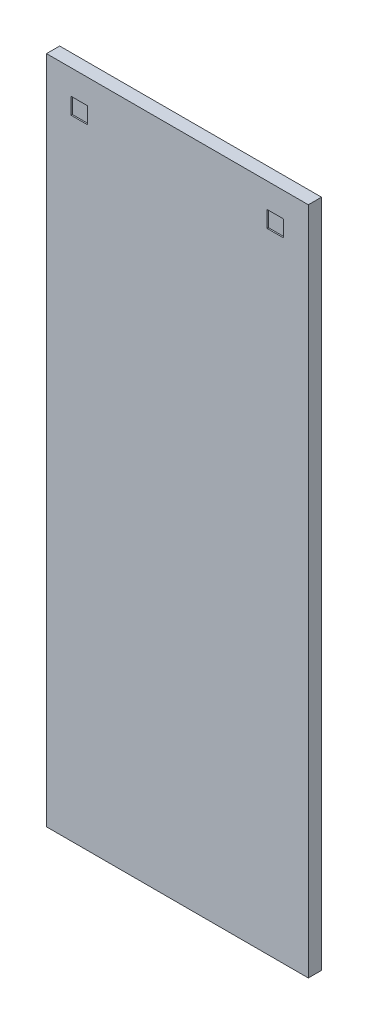
ISO-10303-21;
HEADER;
FILE_DESCRIPTION(('STEP AP214'),'2;1');
FILE_NAME('part.step','',(''),(''),'','','');
FILE_SCHEMA(('AUTOMOTIVE_DESIGN { 1 0 10303 214 1 1 1 1 }'));
ENDSEC;
DATA;
#1=APPLICATION_CONTEXT('core data for automotive mechanical design processes');
#2=APPLICATION_PROTOCOL_DEFINITION('international standard','automotive_design',2000,#1);
#3=PRODUCT_CONTEXT('',#1,'mechanical');
#4=PRODUCT('Part','Part','',(#3));
#5=PRODUCT_RELATED_PRODUCT_CATEGORY('part','',(#4));
#6=PRODUCT_DEFINITION_FORMATION('','',#4);
#7=PRODUCT_DEFINITION_CONTEXT('part definition',#1,'design');
#8=PRODUCT_DEFINITION('design','',#6,#7);
#9=PRODUCT_DEFINITION_SHAPE('','',#8);
#10=(LENGTH_UNIT() NAMED_UNIT(*) SI_UNIT(.MILLI.,.METRE.));
#11=(NAMED_UNIT(*) PLANE_ANGLE_UNIT() SI_UNIT($,.RADIAN.));
#12=(NAMED_UNIT(*) SI_UNIT($,.STERADIAN.) SOLID_ANGLE_UNIT());
#13=UNCERTAINTY_MEASURE_WITH_UNIT(LENGTH_MEASURE(1.E-05),#10,'distance_accuracy_value','');
#14=(GEOMETRIC_REPRESENTATION_CONTEXT(3) GLOBAL_UNCERTAINTY_ASSIGNED_CONTEXT((#13)) GLOBAL_UNIT_ASSIGNED_CONTEXT((#10,
#11,#12)) REPRESENTATION_CONTEXT('',''));
#15=CARTESIAN_POINT('',(0.,0.,0.));
#16=DIRECTION('',(0.,0.,1.));
#17=DIRECTION('',(1.,0.,0.));
#18=AXIS2_PLACEMENT_3D('',#15,#16,#17);
#19=CARTESIAN_POINT('',(-199.,-509.,20.));
#20=DIRECTION('',(1.,0.,0.));
#21=DIRECTION('',(0.,0.,-1.));
#22=AXIS2_PLACEMENT_3D('',#19,#20,#21);
#23=PLANE('',#22);
#24=DIRECTION('',(0.,-1.,0.));
#25=VECTOR('',#24,1.);
#26=CARTESIAN_POINT('',(-199.,-509.,0.));
#27=LINE('',#26,#25);
#28=CARTESIAN_POINT('',(-199.,509.,0.));
#29=VERTEX_POINT('',#28);
#30=CARTESIAN_POINT('',(-199.,-509.,0.));
#31=VERTEX_POINT('',#30);
#32=EDGE_CURVE('E156',#29,#31,#27,.T.);
#33=ORIENTED_EDGE('',*,*,#32,.T.);
#34=DIRECTION('',(0.,0.,-1.));
#35=VECTOR('',#34,1.);
#36=CARTESIAN_POINT('',(-199.,-509.,20.));
#37=LINE('',#36,#35);
#38=CARTESIAN_POINT('',(-199.,-509.,20.));
#39=VERTEX_POINT('',#38);
#40=EDGE_CURVE('E11',#39,#31,#37,.T.);
#41=ORIENTED_EDGE('',*,*,#40,.F.);
#42=DIRECTION('',(0.,-1.,0.));
#43=VECTOR('',#42,1.);
#44=CARTESIAN_POINT('',(-199.,-509.,20.));
#45=LINE('',#44,#43);
#46=CARTESIAN_POINT('',(-199.,509.,20.));
#47=VERTEX_POINT('',#46);
#48=EDGE_CURVE('E189',#47,#39,#45,.T.);
#49=ORIENTED_EDGE('',*,*,#48,.F.);
#50=DIRECTION('',(0.,0.,-1.));
#51=VECTOR('',#50,1.);
#52=CARTESIAN_POINT('',(-199.,509.,20.));
#53=LINE('',#52,#51);
#54=EDGE_CURVE('E199',#47,#29,#53,.T.);
#55=ORIENTED_EDGE('',*,*,#54,.T.);
#56=EDGE_LOOP('',(#33,#41,#49,#55));
#57=FACE_BOUND('',#56,.T.);
#58=ADVANCED_FACE('F32',(#57),#23,.F.);
#59=CARTESIAN_POINT('',(199.,-509.,20.));
#60=DIRECTION('',(0.,1.,0.));
#61=DIRECTION('',(0.,0.,1.));
#62=AXIS2_PLACEMENT_3D('',#59,#60,#61);
#63=PLANE('',#62);
#64=DIRECTION('',(1.,0.,0.));
#65=VECTOR('',#64,1.);
#66=CARTESIAN_POINT('',(199.,-509.,0.));
#67=LINE('',#66,#65);
#68=CARTESIAN_POINT('',(199.,-509.,0.));
#69=VERTEX_POINT('',#68);
#70=EDGE_CURVE('E202',#31,#69,#67,.T.);
#71=ORIENTED_EDGE('',*,*,#70,.T.);
#72=DIRECTION('',(0.,0.,-1.));
#73=VECTOR('',#72,1.);
#74=CARTESIAN_POINT('',(199.,-509.,20.));
#75=LINE('',#74,#73);
#76=CARTESIAN_POINT('',(199.,-509.,20.));
#77=VERTEX_POINT('',#76);
#78=EDGE_CURVE('E39',#77,#69,#75,.T.);
#79=ORIENTED_EDGE('',*,*,#78,.F.);
#80=DIRECTION('',(1.,0.,0.));
#81=VECTOR('',#80,1.);
#82=CARTESIAN_POINT('',(199.,-509.,20.));
#83=LINE('',#82,#81);
#84=EDGE_CURVE('E192',#39,#77,#83,.T.);
#85=ORIENTED_EDGE('',*,*,#84,.F.);
#86=ORIENTED_EDGE('',*,*,#40,.T.);
#87=EDGE_LOOP('',(#71,#79,#85,#86));
#88=FACE_BOUND('',#87,.T.);
#89=ADVANCED_FACE('F232',(#88),#63,.F.);
#90=CARTESIAN_POINT('',(199.,-509.,20.));
#91=DIRECTION('',(-1.,0.,0.));
#92=DIRECTION('',(0.,0.,1.));
#93=AXIS2_PLACEMENT_3D('',#90,#91,#92);
#94=PLANE('',#93);
#95=DIRECTION('',(0.,1.,0.));
#96=VECTOR('',#95,1.);
#97=CARTESIAN_POINT('',(199.,-509.,0.));
#98=LINE('',#97,#96);
#99=CARTESIAN_POINT('',(199.,509.,0.));
#100=VERTEX_POINT('',#99);
#101=EDGE_CURVE('E204',#69,#100,#98,.T.);
#102=ORIENTED_EDGE('',*,*,#101,.T.);
#103=DIRECTION('',(0.,0.,-1.));
#104=VECTOR('',#103,1.);
#105=CARTESIAN_POINT('',(199.,509.,20.));
#106=LINE('',#105,#104);
#107=CARTESIAN_POINT('',(199.,509.,20.));
#108=VERTEX_POINT('',#107);
#109=EDGE_CURVE('E209',#108,#100,#106,.T.);
#110=ORIENTED_EDGE('',*,*,#109,.F.);
#111=DIRECTION('',(0.,1.,0.));
#112=VECTOR('',#111,1.);
#113=CARTESIAN_POINT('',(199.,-509.,20.));
#114=LINE('',#113,#112);
#115=EDGE_CURVE('E195',#77,#108,#114,.T.);
#116=ORIENTED_EDGE('',*,*,#115,.F.);
#117=ORIENTED_EDGE('',*,*,#78,.T.);
#118=EDGE_LOOP('',(#102,#110,#116,#117));
#119=FACE_BOUND('',#118,.T.);
#120=ADVANCED_FACE('F216',(#119),#94,.F.);
#121=CARTESIAN_POINT('',(199.,509.,20.));
#122=DIRECTION('',(0.,-1.,0.));
#123=DIRECTION('',(0.,0.,-1.));
#124=AXIS2_PLACEMENT_3D('',#121,#122,#123);
#125=PLANE('',#124);
#126=DIRECTION('',(-1.,0.,0.));
#127=VECTOR('',#126,1.);
#128=CARTESIAN_POINT('',(199.,509.,0.));
#129=LINE('',#128,#127);
#130=EDGE_CURVE('E193',#100,#29,#129,.T.);
#131=ORIENTED_EDGE('',*,*,#130,.T.);
#132=ORIENTED_EDGE('',*,*,#54,.F.);
#133=DIRECTION('',(-1.,0.,0.));
#134=VECTOR('',#133,1.);
#135=CARTESIAN_POINT('',(199.,509.,20.));
#136=LINE('',#135,#134);
#137=EDGE_CURVE('E197',#108,#47,#136,.T.);
#138=ORIENTED_EDGE('',*,*,#137,.F.);
#139=ORIENTED_EDGE('',*,*,#109,.T.);
#140=EDGE_LOOP('',(#131,#132,#138,#139));
#141=FACE_BOUND('',#140,.T.);
#142=ADVANCED_FACE('F225',(#141),#125,.F.);
#143=CARTESIAN_POINT('',(0.,0.,20.));
#144=DIRECTION('',(0.,0.,1.));
#145=DIRECTION('',(1.,0.,0.));
#146=AXIS2_PLACEMENT_3D('',#143,#144,#145);
#147=PLANE('',#146);
#148=DIRECTION('',(0.,-1.,0.));
#149=VECTOR('',#148,1.);
#150=CARTESIAN_POINT('',(136.5,446.5,20.));
#151=LINE('',#150,#149);
#152=CARTESIAN_POINT('',(136.5,471.5,20.));
#153=VERTEX_POINT('',#152);
#154=CARTESIAN_POINT('',(136.5,446.5,20.));
#155=VERTEX_POINT('',#154);
#156=EDGE_CURVE('E46',#153,#155,#151,.T.);
#157=ORIENTED_EDGE('',*,*,#156,.F.);
#158=DIRECTION('',(-1.,0.,0.));
#159=VECTOR('',#158,1.);
#160=CARTESIAN_POINT('',(161.5,471.5,20.));
#161=LINE('',#160,#159);
#162=CARTESIAN_POINT('',(161.5,471.5,20.));
#163=VERTEX_POINT('',#162);
#164=EDGE_CURVE('E140',#163,#153,#161,.T.);
#165=ORIENTED_EDGE('',*,*,#164,.F.);
#166=DIRECTION('',(0.,1.,0.));
#167=VECTOR('',#166,1.);
#168=CARTESIAN_POINT('',(161.5,446.5,20.));
#169=LINE('',#168,#167);
#170=CARTESIAN_POINT('',(161.5,446.5,20.));
#171=VERTEX_POINT('',#170);
#172=EDGE_CURVE('E143',#171,#163,#169,.T.);
#173=ORIENTED_EDGE('',*,*,#172,.F.);
#174=DIRECTION('',(1.,0.,0.));
#175=VECTOR('',#174,1.);
#176=CARTESIAN_POINT('',(161.5,446.5,20.));
#177=LINE('',#176,#175);
#178=EDGE_CURVE('E149',#155,#171,#177,.T.);
#179=ORIENTED_EDGE('',*,*,#178,.F.);
#180=EDGE_LOOP('',(#157,#165,#173,#179));
#181=FACE_BOUND('',#180,.T.);
#182=DIRECTION('',(0.,-1.,0.));
#183=VECTOR('',#182,1.);
#184=CARTESIAN_POINT('',(-161.5,446.5,20.));
#185=LINE('',#184,#183);
#186=CARTESIAN_POINT('',(-161.5,471.5,20.));
#187=VERTEX_POINT('',#186);
#188=CARTESIAN_POINT('',(-161.5,446.5,20.));
#189=VERTEX_POINT('',#188);
#190=EDGE_CURVE('E54',#187,#189,#185,.T.);
#191=ORIENTED_EDGE('',*,*,#190,.F.);
#192=DIRECTION('',(-1.,0.,0.));
#193=VECTOR('',#192,1.);
#194=CARTESIAN_POINT('',(-136.5,471.5,20.));
#195=LINE('',#194,#193);
#196=CARTESIAN_POINT('',(-136.5,471.5,20.));
#197=VERTEX_POINT('',#196);
#198=EDGE_CURVE('E164',#197,#187,#195,.T.);
#199=ORIENTED_EDGE('',*,*,#198,.F.);
#200=DIRECTION('',(0.,1.,0.));
#201=VECTOR('',#200,1.);
#202=CARTESIAN_POINT('',(-136.5,446.5,20.));
#203=LINE('',#202,#201);
#204=CARTESIAN_POINT('',(-136.5,446.5,20.));
#205=VERTEX_POINT('',#204);
#206=EDGE_CURVE('E178',#205,#197,#203,.T.);
#207=ORIENTED_EDGE('',*,*,#206,.F.);
#208=DIRECTION('',(1.,0.,0.));
#209=VECTOR('',#208,1.);
#210=CARTESIAN_POINT('',(-136.5,446.5,20.));
#211=LINE('',#210,#209);
#212=EDGE_CURVE('E175',#189,#205,#211,.T.);
#213=ORIENTED_EDGE('',*,*,#212,.F.);
#214=EDGE_LOOP('',(#191,#199,#207,#213));
#215=FACE_BOUND('',#214,.T.);
#216=ORIENTED_EDGE('',*,*,#48,.T.);
#217=ORIENTED_EDGE('',*,*,#84,.T.);
#218=ORIENTED_EDGE('',*,*,#115,.T.);
#219=ORIENTED_EDGE('',*,*,#137,.T.);
#220=EDGE_LOOP('',(#216,#217,#218,#219));
#221=FACE_BOUND('',#220,.T.);
#222=ADVANCED_FACE('F231',(#181,#215,#221),#147,.T.);
#223=CARTESIAN_POINT('',(0.,0.,0.));
#224=DIRECTION('',(0.,0.,1.));
#225=DIRECTION('',(1.,0.,0.));
#226=AXIS2_PLACEMENT_3D('',#223,#224,#225);
#227=PLANE('',#226);
#228=ORIENTED_EDGE('',*,*,#32,.F.);
#229=ORIENTED_EDGE('',*,*,#130,.F.);
#230=ORIENTED_EDGE('',*,*,#101,.F.);
#231=ORIENTED_EDGE('',*,*,#70,.F.);
#232=EDGE_LOOP('',(#228,#229,#230,#231));
#233=FACE_BOUND('',#232,.T.);
#234=ADVANCED_FACE('F222',(#233),#227,.F.);
#235=CARTESIAN_POINT('',(-161.5,446.5,18.));
#236=DIRECTION('',(-1.,0.,0.));
#237=DIRECTION('',(0.,0.,1.));
#238=AXIS2_PLACEMENT_3D('',#235,#236,#237);
#239=PLANE('',#238);
#240=ORIENTED_EDGE('',*,*,#190,.T.);
#241=DIRECTION('',(0.,0.,1.));
#242=VECTOR('',#241,1.);
#243=CARTESIAN_POINT('',(-161.5,446.5,18.));
#244=LINE('',#243,#242);
#245=CARTESIAN_POINT('',(-161.5,446.5,18.));
#246=VERTEX_POINT('',#245);
#247=EDGE_CURVE('E173',#246,#189,#244,.T.);
#248=ORIENTED_EDGE('',*,*,#247,.F.);
#249=DIRECTION('',(0.,-1.,0.));
#250=VECTOR('',#249,1.);
#251=CARTESIAN_POINT('',(-161.5,446.5,18.));
#252=LINE('',#251,#250);
#253=CARTESIAN_POINT('',(-161.5,471.5,18.));
#254=VERTEX_POINT('',#253);
#255=EDGE_CURVE('E160',#254,#246,#252,.T.);
#256=ORIENTED_EDGE('',*,*,#255,.F.);
#257=DIRECTION('',(0.,0.,1.));
#258=VECTOR('',#257,1.);
#259=CARTESIAN_POINT('',(-161.5,471.5,18.));
#260=LINE('',#259,#258);
#261=EDGE_CURVE('E150',#254,#187,#260,.T.);
#262=ORIENTED_EDGE('',*,*,#261,.T.);
#263=EDGE_LOOP('',(#240,#248,#256,#262));
#264=FACE_BOUND('',#263,.T.);
#265=ADVANCED_FACE('F244',(#264),#239,.F.);
#266=CARTESIAN_POINT('',(-136.5,471.5,18.));
#267=DIRECTION('',(0.,1.,0.));
#268=DIRECTION('',(0.,0.,1.));
#269=AXIS2_PLACEMENT_3D('',#266,#267,#268);
#270=PLANE('',#269);
#271=ORIENTED_EDGE('',*,*,#198,.T.);
#272=ORIENTED_EDGE('',*,*,#261,.F.);
#273=DIRECTION('',(-1.,0.,0.));
#274=VECTOR('',#273,1.);
#275=CARTESIAN_POINT('',(-136.5,471.5,18.));
#276=LINE('',#275,#274);
#277=CARTESIAN_POINT('',(-136.5,471.5,18.));
#278=VERTEX_POINT('',#277);
#279=EDGE_CURVE('E170',#278,#254,#276,.T.);
#280=ORIENTED_EDGE('',*,*,#279,.F.);
#281=DIRECTION('',(0.,0.,1.));
#282=VECTOR('',#281,1.);
#283=CARTESIAN_POINT('',(-136.5,471.5,18.));
#284=LINE('',#283,#282);
#285=EDGE_CURVE('E184',#278,#197,#284,.T.);
#286=ORIENTED_EDGE('',*,*,#285,.T.);
#287=EDGE_LOOP('',(#271,#272,#280,#286));
#288=FACE_BOUND('',#287,.T.);
#289=ADVANCED_FACE('F250',(#288),#270,.F.);
#290=CARTESIAN_POINT('',(-136.5,446.5,18.));
#291=DIRECTION('',(1.,0.,0.));
#292=DIRECTION('',(0.,0.,-1.));
#293=AXIS2_PLACEMENT_3D('',#290,#291,#292);
#294=PLANE('',#293);
#295=ORIENTED_EDGE('',*,*,#206,.T.);
#296=ORIENTED_EDGE('',*,*,#285,.F.);
#297=DIRECTION('',(0.,1.,0.));
#298=VECTOR('',#297,1.);
#299=CARTESIAN_POINT('',(-136.5,446.5,18.));
#300=LINE('',#299,#298);
#301=CARTESIAN_POINT('',(-136.5,446.5,18.));
#302=VERTEX_POINT('',#301);
#303=EDGE_CURVE('E167',#302,#278,#300,.T.);
#304=ORIENTED_EDGE('',*,*,#303,.F.);
#305=DIRECTION('',(0.,0.,1.));
#306=VECTOR('',#305,1.);
#307=CARTESIAN_POINT('',(-136.5,446.5,18.));
#308=LINE('',#307,#306);
#309=EDGE_CURVE('E186',#302,#205,#308,.T.);
#310=ORIENTED_EDGE('',*,*,#309,.T.);
#311=EDGE_LOOP('',(#295,#296,#304,#310));
#312=FACE_BOUND('',#311,.T.);
#313=ADVANCED_FACE('F255',(#312),#294,.F.);
#314=CARTESIAN_POINT('',(-136.5,446.5,18.));
#315=DIRECTION('',(0.,-1.,0.));
#316=DIRECTION('',(0.,0.,-1.));
#317=AXIS2_PLACEMENT_3D('',#314,#315,#316);
#318=PLANE('',#317);
#319=ORIENTED_EDGE('',*,*,#212,.T.);
#320=ORIENTED_EDGE('',*,*,#309,.F.);
#321=DIRECTION('',(1.,0.,0.));
#322=VECTOR('',#321,1.);
#323=CARTESIAN_POINT('',(-136.5,446.5,18.));
#324=LINE('',#323,#322);
#325=EDGE_CURVE('E163',#246,#302,#324,.T.);
#326=ORIENTED_EDGE('',*,*,#325,.F.);
#327=ORIENTED_EDGE('',*,*,#247,.T.);
#328=EDGE_LOOP('',(#319,#320,#326,#327));
#329=FACE_BOUND('',#328,.T.);
#330=ADVANCED_FACE('F251',(#329),#318,.F.);
#331=CARTESIAN_POINT('',(0.,0.,18.));
#332=DIRECTION('',(0.,0.,1.));
#333=DIRECTION('',(1.,0.,0.));
#334=AXIS2_PLACEMENT_3D('',#331,#332,#333);
#335=PLANE('',#334);
#336=ORIENTED_EDGE('',*,*,#255,.T.);
#337=ORIENTED_EDGE('',*,*,#325,.T.);
#338=ORIENTED_EDGE('',*,*,#303,.T.);
#339=ORIENTED_EDGE('',*,*,#279,.T.);
#340=EDGE_LOOP('',(#336,#337,#338,#339));
#341=FACE_BOUND('',#340,.T.);
#342=ADVANCED_FACE('F254',(#341),#335,.T.);
#343=CARTESIAN_POINT('',(136.5,446.5,18.));
#344=DIRECTION('',(-1.,0.,0.));
#345=DIRECTION('',(0.,0.,1.));
#346=AXIS2_PLACEMENT_3D('',#343,#344,#345);
#347=PLANE('',#346);
#348=ORIENTED_EDGE('',*,*,#156,.T.);
#349=DIRECTION('',(0.,0.,1.));
#350=VECTOR('',#349,1.);
#351=CARTESIAN_POINT('',(136.5,446.5,18.));
#352=LINE('',#351,#350);
#353=CARTESIAN_POINT('',(136.5,446.5,18.));
#354=VERTEX_POINT('',#353);
#355=EDGE_CURVE('E118',#354,#155,#352,.T.);
#356=ORIENTED_EDGE('',*,*,#355,.F.);
#357=DIRECTION('',(0.,-1.,0.));
#358=VECTOR('',#357,1.);
#359=CARTESIAN_POINT('',(136.5,446.5,18.));
#360=LINE('',#359,#358);
#361=CARTESIAN_POINT('',(136.5,471.5,18.));
#362=VERTEX_POINT('',#361);
#363=EDGE_CURVE('E122',#362,#354,#360,.T.);
#364=ORIENTED_EDGE('',*,*,#363,.F.);
#365=DIRECTION('',(0.,0.,1.));
#366=VECTOR('',#365,1.);
#367=CARTESIAN_POINT('',(136.5,471.5,18.));
#368=LINE('',#367,#366);
#369=EDGE_CURVE('E154',#362,#153,#368,.T.);
#370=ORIENTED_EDGE('',*,*,#369,.T.);
#371=EDGE_LOOP('',(#348,#356,#364,#370));
#372=FACE_BOUND('',#371,.T.);
#373=ADVANCED_FACE('F120',(#372),#347,.F.);
#374=CARTESIAN_POINT('',(161.5,471.5,18.));
#375=DIRECTION('',(0.,1.,0.));
#376=DIRECTION('',(0.,0.,1.));
#377=AXIS2_PLACEMENT_3D('',#374,#375,#376);
#378=PLANE('',#377);
#379=ORIENTED_EDGE('',*,*,#164,.T.);
#380=ORIENTED_EDGE('',*,*,#369,.F.);
#381=DIRECTION('',(-1.,0.,0.));
#382=VECTOR('',#381,1.);
#383=CARTESIAN_POINT('',(161.5,471.5,18.));
#384=LINE('',#383,#382);
#385=CARTESIAN_POINT('',(161.5,471.5,18.));
#386=VERTEX_POINT('',#385);
#387=EDGE_CURVE('E128',#386,#362,#384,.T.);
#388=ORIENTED_EDGE('',*,*,#387,.F.);
#389=DIRECTION('',(0.,0.,1.));
#390=VECTOR('',#389,1.);
#391=CARTESIAN_POINT('',(161.5,471.5,18.));
#392=LINE('',#391,#390);
#393=EDGE_CURVE('E157',#386,#163,#392,.T.);
#394=ORIENTED_EDGE('',*,*,#393,.T.);
#395=EDGE_LOOP('',(#379,#380,#388,#394));
#396=FACE_BOUND('',#395,.T.);
#397=ADVANCED_FACE('F268',(#396),#378,.F.);
#398=CARTESIAN_POINT('',(161.5,446.5,18.));
#399=DIRECTION('',(1.,0.,0.));
#400=DIRECTION('',(0.,0.,-1.));
#401=AXIS2_PLACEMENT_3D('',#398,#399,#400);
#402=PLANE('',#401);
#403=ORIENTED_EDGE('',*,*,#172,.T.);
#404=ORIENTED_EDGE('',*,*,#393,.F.);
#405=DIRECTION('',(0.,1.,0.));
#406=VECTOR('',#405,1.);
#407=CARTESIAN_POINT('',(161.5,446.5,18.));
#408=LINE('',#407,#406);
#409=CARTESIAN_POINT('',(161.5,446.5,18.));
#410=VERTEX_POINT('',#409);
#411=EDGE_CURVE('E136',#410,#386,#408,.T.);
#412=ORIENTED_EDGE('',*,*,#411,.F.);
#413=DIRECTION('',(0.,0.,1.));
#414=VECTOR('',#413,1.);
#415=CARTESIAN_POINT('',(161.5,446.5,18.));
#416=LINE('',#415,#414);
#417=EDGE_CURVE('E127',#410,#171,#416,.T.);
#418=ORIENTED_EDGE('',*,*,#417,.T.);
#419=EDGE_LOOP('',(#403,#404,#412,#418));
#420=FACE_BOUND('',#419,.T.);
#421=ADVANCED_FACE('F271',(#420),#402,.F.);
#422=CARTESIAN_POINT('',(161.5,446.5,18.));
#423=DIRECTION('',(0.,-1.,0.));
#424=DIRECTION('',(0.,0.,-1.));
#425=AXIS2_PLACEMENT_3D('',#422,#423,#424);
#426=PLANE('',#425);
#427=ORIENTED_EDGE('',*,*,#178,.T.);
#428=ORIENTED_EDGE('',*,*,#417,.F.);
#429=DIRECTION('',(1.,0.,0.));
#430=VECTOR('',#429,1.);
#431=CARTESIAN_POINT('',(161.5,446.5,18.));
#432=LINE('',#431,#430);
#433=EDGE_CURVE('E131',#354,#410,#432,.T.);
#434=ORIENTED_EDGE('',*,*,#433,.F.);
#435=ORIENTED_EDGE('',*,*,#355,.T.);
#436=EDGE_LOOP('',(#427,#428,#434,#435));
#437=FACE_BOUND('',#436,.T.);
#438=ADVANCED_FACE('F132',(#437),#426,.F.);
#439=CARTESIAN_POINT('',(0.,0.,18.));
#440=DIRECTION('',(0.,0.,1.));
#441=DIRECTION('',(1.,0.,0.));
#442=AXIS2_PLACEMENT_3D('',#439,#440,#441);
#443=PLANE('',#442);
#444=ORIENTED_EDGE('',*,*,#363,.T.);
#445=ORIENTED_EDGE('',*,*,#433,.T.);
#446=ORIENTED_EDGE('',*,*,#411,.T.);
#447=ORIENTED_EDGE('',*,*,#387,.T.);
#448=EDGE_LOOP('',(#444,#445,#446,#447));
#449=FACE_BOUND('',#448,.T.);
#450=ADVANCED_FACE('F138',(#449),#443,.T.);
#451=CLOSED_SHELL('',(#58,#89,#120,#142,#222,#234,#265,#289,#313,#330,#342,#373,#397,#421,#438,#450));
#452=MANIFOLD_SOLID_BREP('B2',#451);
#453=ADVANCED_BREP_SHAPE_REPRESENTATION('',(#18,#452),#14);
#454=SHAPE_DEFINITION_REPRESENTATION(#9,#453);
ENDSEC;
END-ISO-10303-21;
